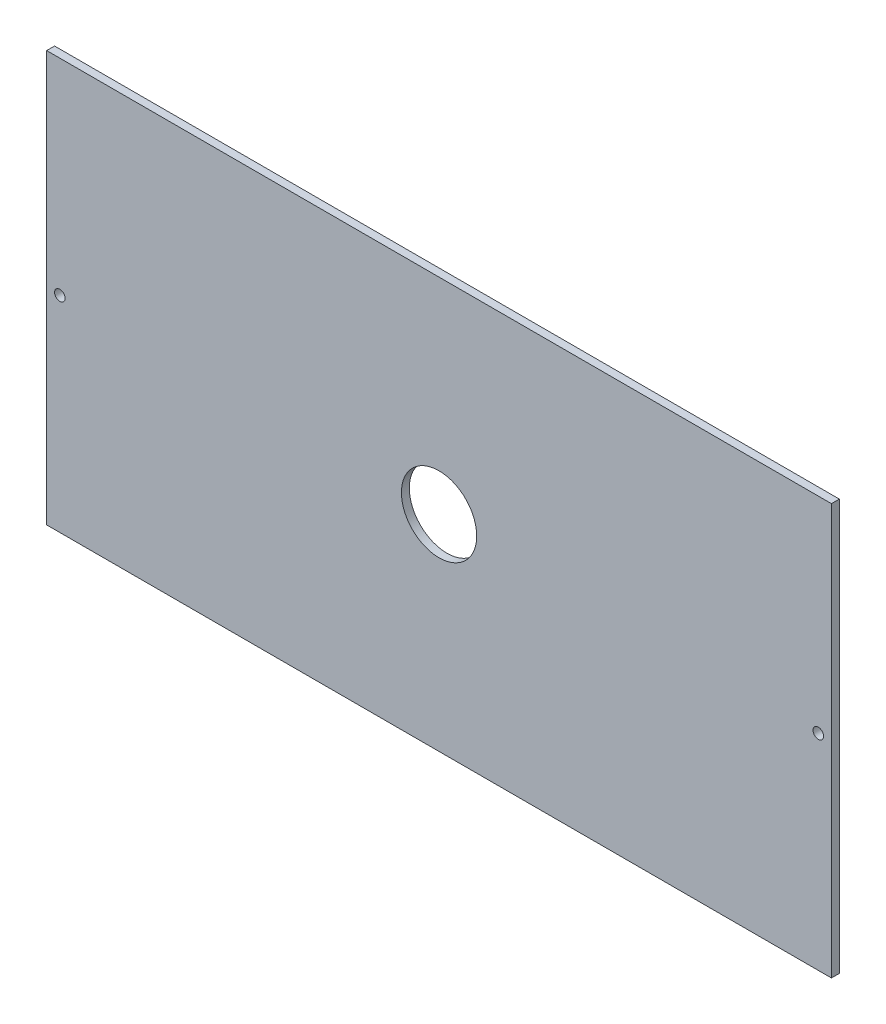
ISO-10303-21;
HEADER;
FILE_DESCRIPTION(('STEP AP214'),'2;1');
FILE_NAME('part.step','',(''),(''),'','','');
FILE_SCHEMA(('AUTOMOTIVE_DESIGN { 1 0 10303 214 1 1 1 1 }'));
ENDSEC;
DATA;
#1=APPLICATION_CONTEXT('core data for automotive mechanical design processes');
#2=APPLICATION_PROTOCOL_DEFINITION('international standard','automotive_design',2000,#1);
#3=PRODUCT_CONTEXT('',#1,'mechanical');
#4=PRODUCT('Part','Part','',(#3));
#5=PRODUCT_RELATED_PRODUCT_CATEGORY('part','',(#4));
#6=PRODUCT_DEFINITION_FORMATION('','',#4);
#7=PRODUCT_DEFINITION_CONTEXT('part definition',#1,'design');
#8=PRODUCT_DEFINITION('design','',#6,#7);
#9=PRODUCT_DEFINITION_SHAPE('','',#8);
#10=(LENGTH_UNIT() NAMED_UNIT(*) SI_UNIT(.MILLI.,.METRE.));
#11=(NAMED_UNIT(*) PLANE_ANGLE_UNIT() SI_UNIT($,.RADIAN.));
#12=(NAMED_UNIT(*) SI_UNIT($,.STERADIAN.) SOLID_ANGLE_UNIT());
#13=UNCERTAINTY_MEASURE_WITH_UNIT(LENGTH_MEASURE(1.E-05),#10,'distance_accuracy_value','');
#14=(GEOMETRIC_REPRESENTATION_CONTEXT(3) GLOBAL_UNCERTAINTY_ASSIGNED_CONTEXT((#13)) GLOBAL_UNIT_ASSIGNED_CONTEXT((#10,
#11,#12)) REPRESENTATION_CONTEXT('',''));
#15=CARTESIAN_POINT('',(0.,0.,0.));
#16=DIRECTION('',(0.,0.,1.));
#17=DIRECTION('',(1.,0.,0.));
#18=AXIS2_PLACEMENT_3D('',#15,#16,#17);
#19=CARTESIAN_POINT('',(0.,0.,3.));
#20=DIRECTION('',(0.,0.,1.));
#21=DIRECTION('',(1.,0.,0.));
#22=AXIS2_PLACEMENT_3D('',#19,#20,#21);
#23=PLANE('',#22);
#24=CARTESIAN_POINT('',(5.,-78.,3.));
#25=DIRECTION('',(0.,0.,1.));
#26=DIRECTION('',(1.,0.,0.));
#27=AXIS2_PLACEMENT_3D('',#24,#25,#26);
#28=CIRCLE('',#27,2.);
#29=CARTESIAN_POINT('',(7.,-78.,3.));
#30=VERTEX_POINT('',#29);
#31=EDGE_CURVE('E140',#30,#30,#28,.T.);
#32=ORIENTED_EDGE('',*,*,#31,.F.);
#33=EDGE_LOOP('',(#32));
#34=FACE_BOUND('',#33,.T.);
#35=DIRECTION('',(0.,-1.,0.));
#36=VECTOR('',#35,1.);
#37=CARTESIAN_POINT('',(0.,0.,3.));
#38=LINE('',#37,#36);
#39=CARTESIAN_POINT('',(0.,0.,3.));
#40=VERTEX_POINT('',#39);
#41=CARTESIAN_POINT('',(0.,-156.,3.));
#42=VERTEX_POINT('',#41);
#43=EDGE_CURVE('E98',#40,#42,#38,.T.);
#44=ORIENTED_EDGE('',*,*,#43,.T.);
#45=DIRECTION('',(1.,0.,0.));
#46=VECTOR('',#45,1.);
#47=CARTESIAN_POINT('',(0.,-156.,3.));
#48=LINE('',#47,#46);
#49=CARTESIAN_POINT('',(298.,-156.,3.));
#50=VERTEX_POINT('',#49);
#51=EDGE_CURVE('E93',#42,#50,#48,.T.);
#52=ORIENTED_EDGE('',*,*,#51,.T.);
#53=DIRECTION('',(0.,1.,0.));
#54=VECTOR('',#53,1.);
#55=CARTESIAN_POINT('',(298.,0.,3.));
#56=LINE('',#55,#54);
#57=CARTESIAN_POINT('',(298.,0.,3.));
#58=VERTEX_POINT('',#57);
#59=EDGE_CURVE('E96',#50,#58,#56,.T.);
#60=ORIENTED_EDGE('',*,*,#59,.T.);
#61=DIRECTION('',(-1.,0.,0.));
#62=VECTOR('',#61,1.);
#63=CARTESIAN_POINT('',(0.,0.,3.));
#64=LINE('',#63,#62);
#65=EDGE_CURVE('E63',#58,#40,#64,.T.);
#66=ORIENTED_EDGE('',*,*,#65,.T.);
#67=EDGE_LOOP('',(#44,#52,#60,#66));
#68=FACE_BOUND('',#67,.T.);
#69=CARTESIAN_POINT('',(149.,-78.,3.));
#70=DIRECTION('',(0.,0.,1.));
#71=DIRECTION('',(1.,0.,0.));
#72=AXIS2_PLACEMENT_3D('',#69,#70,#71);
#73=CIRCLE('',#72,14.3054356797411);
#74=CARTESIAN_POINT('',(163.305435679741,-78.,3.));
#75=VERTEX_POINT('',#74);
#76=EDGE_CURVE('E118',#75,#75,#73,.T.);
#77=ORIENTED_EDGE('',*,*,#76,.F.);
#78=EDGE_LOOP('',(#77));
#79=FACE_BOUND('',#78,.T.);
#80=CARTESIAN_POINT('',(293.,-78.,3.));
#81=DIRECTION('',(0.,0.,1.));
#82=DIRECTION('',(-1.,0.,0.));
#83=AXIS2_PLACEMENT_3D('',#80,#81,#82);
#84=CIRCLE('',#83,2.);
#85=CARTESIAN_POINT('',(291.,-78.,3.));
#86=VERTEX_POINT('',#85);
#87=EDGE_CURVE('E148',#86,#86,#84,.T.);
#88=ORIENTED_EDGE('',*,*,#87,.F.);
#89=EDGE_LOOP('',(#88));
#90=FACE_BOUND('',#89,.T.);
#91=ADVANCED_FACE('F45',(#34,#68,#79,#90),#23,.T.);
#92=CARTESIAN_POINT('',(0.,0.,0.));
#93=DIRECTION('',(0.,0.,1.));
#94=DIRECTION('',(1.,0.,0.));
#95=AXIS2_PLACEMENT_3D('',#92,#93,#94);
#96=PLANE('',#95);
#97=DIRECTION('',(0.,-1.,0.));
#98=VECTOR('',#97,1.);
#99=CARTESIAN_POINT('',(0.,0.,0.));
#100=LINE('',#99,#98);
#101=CARTESIAN_POINT('',(0.,0.,0.));
#102=VERTEX_POINT('',#101);
#103=CARTESIAN_POINT('',(0.,-156.,0.));
#104=VERTEX_POINT('',#103);
#105=EDGE_CURVE('E114',#102,#104,#100,.T.);
#106=ORIENTED_EDGE('',*,*,#105,.F.);
#107=DIRECTION('',(-1.,0.,0.));
#108=VECTOR('',#107,1.);
#109=CARTESIAN_POINT('',(0.,0.,0.));
#110=LINE('',#109,#108);
#111=CARTESIAN_POINT('',(298.,0.,0.));
#112=VERTEX_POINT('',#111);
#113=EDGE_CURVE('E86',#112,#102,#110,.T.);
#114=ORIENTED_EDGE('',*,*,#113,.F.);
#115=DIRECTION('',(0.,1.,0.));
#116=VECTOR('',#115,1.);
#117=CARTESIAN_POINT('',(298.,0.,0.));
#118=LINE('',#117,#116);
#119=CARTESIAN_POINT('',(298.,-156.,0.));
#120=VERTEX_POINT('',#119);
#121=EDGE_CURVE('E80',#120,#112,#118,.T.);
#122=ORIENTED_EDGE('',*,*,#121,.F.);
#123=DIRECTION('',(1.,0.,0.));
#124=VECTOR('',#123,1.);
#125=CARTESIAN_POINT('',(0.,-156.,0.));
#126=LINE('',#125,#124);
#127=EDGE_CURVE('E103',#104,#120,#126,.T.);
#128=ORIENTED_EDGE('',*,*,#127,.F.);
#129=EDGE_LOOP('',(#106,#114,#122,#128));
#130=FACE_BOUND('',#129,.T.);
#131=CARTESIAN_POINT('',(149.,-78.,0.));
#132=DIRECTION('',(0.,0.,1.));
#133=DIRECTION('',(1.,0.,0.));
#134=AXIS2_PLACEMENT_3D('',#131,#132,#133);
#135=CIRCLE('',#134,14.3054356797411);
#136=CARTESIAN_POINT('',(163.305435679741,-78.,0.));
#137=VERTEX_POINT('',#136);
#138=EDGE_CURVE('E136',#137,#137,#135,.T.);
#139=ORIENTED_EDGE('',*,*,#138,.T.);
#140=EDGE_LOOP('',(#139));
#141=FACE_BOUND('',#140,.T.);
#142=CARTESIAN_POINT('',(5.,-78.,0.));
#143=DIRECTION('',(0.,0.,1.));
#144=DIRECTION('',(1.,0.,0.));
#145=AXIS2_PLACEMENT_3D('',#142,#143,#144);
#146=CIRCLE('',#145,2.);
#147=CARTESIAN_POINT('',(7.,-78.,0.));
#148=VERTEX_POINT('',#147);
#149=EDGE_CURVE('E144',#148,#148,#146,.T.);
#150=ORIENTED_EDGE('',*,*,#149,.T.);
#151=EDGE_LOOP('',(#150));
#152=FACE_BOUND('',#151,.T.);
#153=CARTESIAN_POINT('',(293.,-78.,0.));
#154=DIRECTION('',(0.,0.,1.));
#155=DIRECTION('',(-1.,0.,0.));
#156=AXIS2_PLACEMENT_3D('',#153,#154,#155);
#157=CIRCLE('',#156,2.);
#158=CARTESIAN_POINT('',(291.,-78.,0.));
#159=VERTEX_POINT('',#158);
#160=EDGE_CURVE('E152',#159,#159,#157,.T.);
#161=ORIENTED_EDGE('',*,*,#160,.T.);
#162=EDGE_LOOP('',(#161));
#163=FACE_BOUND('',#162,.T.);
#164=ADVANCED_FACE('F131',(#130,#141,#152,#163),#96,.F.);
#165=CARTESIAN_POINT('',(0.,0.,3.));
#166=DIRECTION('',(1.,0.,0.));
#167=DIRECTION('',(0.,1.,0.));
#168=AXIS2_PLACEMENT_3D('',#165,#166,#167);
#169=PLANE('',#168);
#170=ORIENTED_EDGE('',*,*,#105,.T.);
#171=DIRECTION('',(0.,0.,-1.));
#172=VECTOR('',#171,1.);
#173=CARTESIAN_POINT('',(0.,-156.,3.));
#174=LINE('',#173,#172);
#175=EDGE_CURVE('E11',#42,#104,#174,.T.);
#176=ORIENTED_EDGE('',*,*,#175,.F.);
#177=ORIENTED_EDGE('',*,*,#43,.F.);
#178=DIRECTION('',(0.,0.,-1.));
#179=VECTOR('',#178,1.);
#180=CARTESIAN_POINT('',(0.,0.,3.));
#181=LINE('',#180,#179);
#182=EDGE_CURVE('E110',#40,#102,#181,.T.);
#183=ORIENTED_EDGE('',*,*,#182,.T.);
#184=EDGE_LOOP('',(#170,#176,#177,#183));
#185=FACE_BOUND('',#184,.T.);
#186=ADVANCED_FACE('F47',(#185),#169,.F.);
#187=CARTESIAN_POINT('',(0.,-156.,3.));
#188=DIRECTION('',(0.,1.,0.));
#189=DIRECTION('',(0.,0.,1.));
#190=AXIS2_PLACEMENT_3D('',#187,#188,#189);
#191=PLANE('',#190);
#192=ORIENTED_EDGE('',*,*,#127,.T.);
#193=DIRECTION('',(0.,0.,-1.));
#194=VECTOR('',#193,1.);
#195=CARTESIAN_POINT('',(298.,-156.,3.));
#196=LINE('',#195,#194);
#197=EDGE_CURVE('E55',#50,#120,#196,.T.);
#198=ORIENTED_EDGE('',*,*,#197,.F.);
#199=ORIENTED_EDGE('',*,*,#51,.F.);
#200=ORIENTED_EDGE('',*,*,#175,.T.);
#201=EDGE_LOOP('',(#192,#198,#199,#200));
#202=FACE_BOUND('',#201,.T.);
#203=ADVANCED_FACE('F102',(#202),#191,.F.);
#204=CARTESIAN_POINT('',(298.,0.,3.));
#205=DIRECTION('',(-1.,0.,0.));
#206=DIRECTION('',(0.,0.,1.));
#207=AXIS2_PLACEMENT_3D('',#204,#205,#206);
#208=PLANE('',#207);
#209=ORIENTED_EDGE('',*,*,#121,.T.);
#210=DIRECTION('',(0.,0.,-1.));
#211=VECTOR('',#210,1.);
#212=CARTESIAN_POINT('',(298.,0.,3.));
#213=LINE('',#212,#211);
#214=EDGE_CURVE('E105',#58,#112,#213,.T.);
#215=ORIENTED_EDGE('',*,*,#214,.F.);
#216=ORIENTED_EDGE('',*,*,#59,.F.);
#217=ORIENTED_EDGE('',*,*,#197,.T.);
#218=EDGE_LOOP('',(#209,#215,#216,#217));
#219=FACE_BOUND('',#218,.T.);
#220=ADVANCED_FACE('F106',(#219),#208,.F.);
#221=CARTESIAN_POINT('',(0.,0.,3.));
#222=DIRECTION('',(0.,-1.,0.));
#223=DIRECTION('',(1.,0.,0.));
#224=AXIS2_PLACEMENT_3D('',#221,#222,#223);
#225=PLANE('',#224);
#226=ORIENTED_EDGE('',*,*,#113,.T.);
#227=ORIENTED_EDGE('',*,*,#182,.F.);
#228=ORIENTED_EDGE('',*,*,#65,.F.);
#229=ORIENTED_EDGE('',*,*,#214,.T.);
#230=EDGE_LOOP('',(#226,#227,#228,#229));
#231=FACE_BOUND('',#230,.T.);
#232=ADVANCED_FACE('F128',(#231),#225,.F.);
#233=CARTESIAN_POINT('',(149.,-78.,3.));
#234=DIRECTION('',(0.,0.,-1.));
#235=DIRECTION('',(-1.,0.,0.));
#236=AXIS2_PLACEMENT_3D('',#233,#234,#235);
#237=CYLINDRICAL_SURFACE('',#236,14.3054356797411);
#238=ORIENTED_EDGE('',*,*,#76,.T.);
#239=EDGE_LOOP('',(#238));
#240=FACE_BOUND('',#239,.T.);
#241=ORIENTED_EDGE('',*,*,#138,.F.);
#242=EDGE_LOOP('',(#241));
#243=FACE_BOUND('',#242,.T.);
#244=ADVANCED_FACE('F172',(#240,#243),#237,.F.);
#245=CARTESIAN_POINT('',(5.,-78.,3.));
#246=DIRECTION('',(0.,0.,-1.));
#247=DIRECTION('',(-1.,0.,0.));
#248=AXIS2_PLACEMENT_3D('',#245,#246,#247);
#249=CYLINDRICAL_SURFACE('',#248,2.);
#250=ORIENTED_EDGE('',*,*,#31,.T.);
#251=EDGE_LOOP('',(#250));
#252=FACE_BOUND('',#251,.T.);
#253=ORIENTED_EDGE('',*,*,#149,.F.);
#254=EDGE_LOOP('',(#253));
#255=FACE_BOUND('',#254,.T.);
#256=ADVANCED_FACE('F217',(#252,#255),#249,.F.);
#257=CARTESIAN_POINT('',(293.,-78.,3.));
#258=DIRECTION('',(0.,0.,-1.));
#259=DIRECTION('',(-1.,0.,0.));
#260=AXIS2_PLACEMENT_3D('',#257,#258,#259);
#261=CYLINDRICAL_SURFACE('',#260,2.);
#262=ORIENTED_EDGE('',*,*,#87,.T.);
#263=EDGE_LOOP('',(#262));
#264=FACE_BOUND('',#263,.T.);
#265=ORIENTED_EDGE('',*,*,#160,.F.);
#266=EDGE_LOOP('',(#265));
#267=FACE_BOUND('',#266,.T.);
#268=ADVANCED_FACE('F160',(#264,#267),#261,.F.);
#269=CLOSED_SHELL('',(#91,#164,#186,#203,#220,#232,#244,#256,#268));
#270=MANIFOLD_SOLID_BREP('B2',#269);
#271=ADVANCED_BREP_SHAPE_REPRESENTATION('',(#18,#270),#14);
#272=SHAPE_DEFINITION_REPRESENTATION(#9,#271);
ENDSEC;
END-ISO-10303-21;
